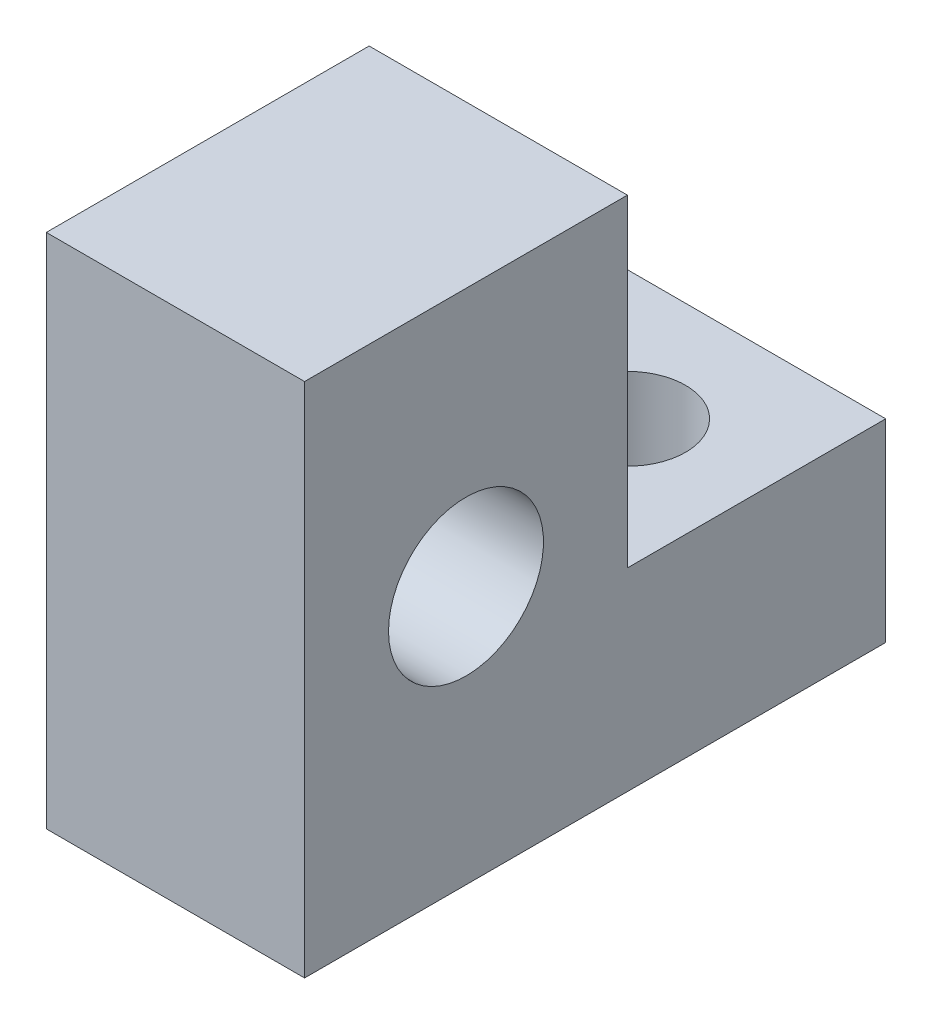
ISO-10303-21;
HEADER;
FILE_DESCRIPTION(('STEP AP214'),'2;1');
FILE_NAME('part.step','',(''),(''),'','','');
FILE_SCHEMA(('AUTOMOTIVE_DESIGN { 1 0 10303 214 1 1 1 1 }'));
ENDSEC;
DATA;
#1=APPLICATION_CONTEXT('core data for automotive mechanical design processes');
#2=APPLICATION_PROTOCOL_DEFINITION('international standard','automotive_design',2000,#1);
#3=PRODUCT_CONTEXT('',#1,'mechanical');
#4=PRODUCT('Part','Part','',(#3));
#5=PRODUCT_RELATED_PRODUCT_CATEGORY('part','',(#4));
#6=PRODUCT_DEFINITION_FORMATION('','',#4);
#7=PRODUCT_DEFINITION_CONTEXT('part definition',#1,'design');
#8=PRODUCT_DEFINITION('design','',#6,#7);
#9=PRODUCT_DEFINITION_SHAPE('','',#8);
#10=(LENGTH_UNIT() NAMED_UNIT(*) SI_UNIT(.MILLI.,.METRE.));
#11=(NAMED_UNIT(*) PLANE_ANGLE_UNIT() SI_UNIT($,.RADIAN.));
#12=(NAMED_UNIT(*) SI_UNIT($,.STERADIAN.) SOLID_ANGLE_UNIT());
#13=UNCERTAINTY_MEASURE_WITH_UNIT(LENGTH_MEASURE(1.E-05),#10,'distance_accuracy_value','');
#14=(GEOMETRIC_REPRESENTATION_CONTEXT(3) GLOBAL_UNCERTAINTY_ASSIGNED_CONTEXT((#13)) GLOBAL_UNIT_ASSIGNED_CONTEXT((#10,
#11,#12)) REPRESENTATION_CONTEXT('',''));
#15=CARTESIAN_POINT('',(0.,0.,0.));
#16=DIRECTION('',(0.,0.,1.));
#17=DIRECTION('',(1.,0.,0.));
#18=AXIS2_PLACEMENT_3D('',#15,#16,#17);
#19=CARTESIAN_POINT('',(-2.,4.,-2.49999999999997));
#20=DIRECTION('',(0.,0.,1.));
#21=DIRECTION('',(1.,0.,0.));
#22=AXIS2_PLACEMENT_3D('',#19,#20,#21);
#23=PLANE('',#22);
#24=DIRECTION('',(1.,0.,0.));
#25=VECTOR('',#24,1.);
#26=CARTESIAN_POINT('',(2.,-1.,-2.49999999999997));
#27=LINE('',#26,#25);
#28=CARTESIAN_POINT('',(-2.,-1.,-2.49999999999997));
#29=VERTEX_POINT('',#28);
#30=CARTESIAN_POINT('',(2.,-1.,-2.49999999999997));
#31=VERTEX_POINT('',#30);
#32=EDGE_CURVE('E59',#29,#31,#27,.T.);
#33=ORIENTED_EDGE('',*,*,#32,.F.);
#34=DIRECTION('',(0.,-1.,0.));
#35=VECTOR('',#34,1.);
#36=CARTESIAN_POINT('',(-2.,4.,-2.49999999999997));
#37=LINE('',#36,#35);
#38=CARTESIAN_POINT('',(-2.,4.,-2.49999999999997));
#39=VERTEX_POINT('',#38);
#40=EDGE_CURVE('E53',#39,#29,#37,.T.);
#41=ORIENTED_EDGE('',*,*,#40,.F.);
#42=DIRECTION('',(-1.,0.,0.));
#43=VECTOR('',#42,1.);
#44=CARTESIAN_POINT('',(-2.,4.,-2.49999999999997));
#45=LINE('',#44,#43);
#46=CARTESIAN_POINT('',(2.,4.,-2.49999999999997));
#47=VERTEX_POINT('',#46);
#48=EDGE_CURVE('E88',#47,#39,#45,.T.);
#49=ORIENTED_EDGE('',*,*,#48,.F.);
#50=DIRECTION('',(0.,-1.,0.));
#51=VECTOR('',#50,1.);
#52=CARTESIAN_POINT('',(2.,4.,-2.49999999999997));
#53=LINE('',#52,#51);
#54=EDGE_CURVE('E13',#47,#31,#53,.T.);
#55=ORIENTED_EDGE('',*,*,#54,.T.);
#56=EDGE_LOOP('',(#33,#41,#49,#55));
#57=FACE_BOUND('',#56,.T.);
#58=ADVANCED_FACE('F45',(#57),#23,.F.);
#59=CARTESIAN_POINT('',(2.,4.,2.50000000000003));
#60=DIRECTION('',(-1.,0.,0.));
#61=DIRECTION('',(0.,0.,1.));
#62=AXIS2_PLACEMENT_3D('',#59,#60,#61);
#63=PLANE('',#62);
#64=CARTESIAN_POINT('',(2.,0.,0.));
#65=DIRECTION('',(-1.,0.,0.));
#66=DIRECTION('',(0.,0.,1.));
#67=AXIS2_PLACEMENT_3D('',#64,#65,#66);
#68=CIRCLE('',#67,1.2);
#69=CARTESIAN_POINT('',(2.,0.,1.2));
#70=VERTEX_POINT('',#69);
#71=EDGE_CURVE('E192',#70,#70,#68,.T.);
#72=ORIENTED_EDGE('',*,*,#71,.T.);
#73=EDGE_LOOP('',(#72));
#74=FACE_BOUND('',#73,.T.);
#75=DIRECTION('',(0.,0.,-1.));
#76=VECTOR('',#75,1.);
#77=CARTESIAN_POINT('',(2.,-4.,2.50000000000003));
#78=LINE('',#77,#76);
#79=CARTESIAN_POINT('',(2.,-4.,2.50000000000003));
#80=VERTEX_POINT('',#79);
#81=CARTESIAN_POINT('',(2.,-4.,-6.49999999999997));
#82=VERTEX_POINT('',#81);
#83=EDGE_CURVE('E105',#80,#82,#78,.T.);
#84=ORIENTED_EDGE('',*,*,#83,.T.);
#85=DIRECTION('',(0.,-1.,0.));
#86=VECTOR('',#85,1.);
#87=CARTESIAN_POINT('',(2.,-4.,-6.49999999999997));
#88=LINE('',#87,#86);
#89=CARTESIAN_POINT('',(2.,-1.,-6.49999999999997));
#90=VERTEX_POINT('',#89);
#91=EDGE_CURVE('E109',#90,#82,#88,.T.);
#92=ORIENTED_EDGE('',*,*,#91,.F.);
#93=DIRECTION('',(0.,0.,1.));
#94=VECTOR('',#93,1.);
#95=CARTESIAN_POINT('',(2.,-1.,-6.49999999999997));
#96=LINE('',#95,#94);
#97=EDGE_CURVE('E134',#90,#31,#96,.T.);
#98=ORIENTED_EDGE('',*,*,#97,.T.);
#99=ORIENTED_EDGE('',*,*,#54,.F.);
#100=DIRECTION('',(0.,0.,-1.));
#101=VECTOR('',#100,1.);
#102=CARTESIAN_POINT('',(2.,4.,2.50000000000003));
#103=LINE('',#102,#101);
#104=CARTESIAN_POINT('',(2.,4.,2.50000000000003));
#105=VERTEX_POINT('',#104);
#106=EDGE_CURVE('E139',#105,#47,#103,.T.);
#107=ORIENTED_EDGE('',*,*,#106,.F.);
#108=DIRECTION('',(0.,-1.,0.));
#109=VECTOR('',#108,1.);
#110=CARTESIAN_POINT('',(2.,4.,2.50000000000003));
#111=LINE('',#110,#109);
#112=EDGE_CURVE('E111',#105,#80,#111,.T.);
#113=ORIENTED_EDGE('',*,*,#112,.T.);
#114=EDGE_LOOP('',(#84,#92,#98,#99,#107,#113));
#115=FACE_BOUND('',#114,.T.);
#116=ADVANCED_FACE('F47',(#74,#115),#63,.F.);
#117=CARTESIAN_POINT('',(-2.,4.,2.50000000000003));
#118=DIRECTION('',(1.,0.,0.));
#119=DIRECTION('',(0.,0.,-1.));
#120=AXIS2_PLACEMENT_3D('',#117,#118,#119);
#121=PLANE('',#120);
#122=CARTESIAN_POINT('',(-2.,0.,0.));
#123=DIRECTION('',(-1.,0.,0.));
#124=DIRECTION('',(0.,0.,1.));
#125=AXIS2_PLACEMENT_3D('',#122,#123,#124);
#126=CIRCLE('',#125,1.2);
#127=CARTESIAN_POINT('',(-2.,0.,1.2));
#128=VERTEX_POINT('',#127);
#129=EDGE_CURVE('E195',#128,#128,#126,.T.);
#130=ORIENTED_EDGE('',*,*,#129,.F.);
#131=EDGE_LOOP('',(#130));
#132=FACE_BOUND('',#131,.T.);
#133=DIRECTION('',(0.,0.,1.));
#134=VECTOR('',#133,1.);
#135=CARTESIAN_POINT('',(-2.,-4.,2.50000000000003));
#136=LINE('',#135,#134);
#137=CARTESIAN_POINT('',(-2.,-4.,-6.49999999999997));
#138=VERTEX_POINT('',#137);
#139=CARTESIAN_POINT('',(-2.,-4.,2.50000000000003));
#140=VERTEX_POINT('',#139);
#141=EDGE_CURVE('E113',#138,#140,#136,.T.);
#142=ORIENTED_EDGE('',*,*,#141,.T.);
#143=DIRECTION('',(0.,-1.,0.));
#144=VECTOR('',#143,1.);
#145=CARTESIAN_POINT('',(-2.,4.,2.50000000000003));
#146=LINE('',#145,#144);
#147=CARTESIAN_POINT('',(-2.,4.,2.50000000000003));
#148=VERTEX_POINT('',#147);
#149=EDGE_CURVE('E148',#148,#140,#146,.T.);
#150=ORIENTED_EDGE('',*,*,#149,.F.);
#151=DIRECTION('',(0.,0.,1.));
#152=VECTOR('',#151,1.);
#153=CARTESIAN_POINT('',(-2.,4.,2.50000000000003));
#154=LINE('',#153,#152);
#155=EDGE_CURVE('E142',#39,#148,#154,.T.);
#156=ORIENTED_EDGE('',*,*,#155,.F.);
#157=ORIENTED_EDGE('',*,*,#40,.T.);
#158=DIRECTION('',(0.,0.,1.));
#159=VECTOR('',#158,1.);
#160=CARTESIAN_POINT('',(-2.,-1.,-6.49999999999997));
#161=LINE('',#160,#159);
#162=CARTESIAN_POINT('',(-2.,-1.,-6.49999999999997));
#163=VERTEX_POINT('',#162);
#164=EDGE_CURVE('E114',#163,#29,#161,.T.);
#165=ORIENTED_EDGE('',*,*,#164,.F.);
#166=DIRECTION('',(0.,1.,0.));
#167=VECTOR('',#166,1.);
#168=CARTESIAN_POINT('',(-2.,-4.,-6.49999999999997));
#169=LINE('',#168,#167);
#170=EDGE_CURVE('E121',#138,#163,#169,.T.);
#171=ORIENTED_EDGE('',*,*,#170,.F.);
#172=EDGE_LOOP('',(#142,#150,#156,#157,#165,#171));
#173=FACE_BOUND('',#172,.T.);
#174=ADVANCED_FACE('F152',(#132,#173),#121,.F.);
#175=CARTESIAN_POINT('',(-2.,4.,2.50000000000003));
#176=DIRECTION('',(0.,0.,-1.));
#177=DIRECTION('',(-1.,0.,0.));
#178=AXIS2_PLACEMENT_3D('',#175,#176,#177);
#179=PLANE('',#178);
#180=DIRECTION('',(1.,0.,0.));
#181=VECTOR('',#180,1.);
#182=CARTESIAN_POINT('',(-2.,-4.,2.50000000000003));
#183=LINE('',#182,#181);
#184=EDGE_CURVE('E83',#140,#80,#183,.T.);
#185=ORIENTED_EDGE('',*,*,#184,.T.);
#186=ORIENTED_EDGE('',*,*,#112,.F.);
#187=DIRECTION('',(1.,0.,0.));
#188=VECTOR('',#187,1.);
#189=CARTESIAN_POINT('',(-2.,4.,2.50000000000003));
#190=LINE('',#189,#188);
#191=EDGE_CURVE('E68',#148,#105,#190,.T.);
#192=ORIENTED_EDGE('',*,*,#191,.F.);
#193=ORIENTED_EDGE('',*,*,#149,.T.);
#194=EDGE_LOOP('',(#185,#186,#192,#193));
#195=FACE_BOUND('',#194,.T.);
#196=ADVANCED_FACE('F165',(#195),#179,.F.);
#197=CARTESIAN_POINT('',(0.,4.,0.));
#198=DIRECTION('',(0.,-1.,0.));
#199=DIRECTION('',(0.,0.,-1.));
#200=AXIS2_PLACEMENT_3D('',#197,#198,#199);
#201=PLANE('',#200);
#202=ORIENTED_EDGE('',*,*,#106,.T.);
#203=ORIENTED_EDGE('',*,*,#48,.T.);
#204=ORIENTED_EDGE('',*,*,#155,.T.);
#205=ORIENTED_EDGE('',*,*,#191,.T.);
#206=EDGE_LOOP('',(#202,#203,#204,#205));
#207=FACE_BOUND('',#206,.T.);
#208=ADVANCED_FACE('F169',(#207),#201,.F.);
#209=CARTESIAN_POINT('',(0.,-4.,0.));
#210=DIRECTION('',(0.,-1.,0.));
#211=DIRECTION('',(0.,0.,-1.));
#212=AXIS2_PLACEMENT_3D('',#209,#210,#211);
#213=PLANE('',#212);
#214=CARTESIAN_POINT('',(0.,-4.,-4.49999999999997));
#215=DIRECTION('',(0.,-1.,0.));
#216=DIRECTION('',(0.,0.,-1.));
#217=AXIS2_PLACEMENT_3D('',#214,#215,#216);
#218=CIRCLE('',#217,0.899999999999988);
#219=CARTESIAN_POINT('',(0.,-4.,-5.39999999999996));
#220=VERTEX_POINT('',#219);
#221=EDGE_CURVE('E128',#220,#220,#218,.T.);
#222=ORIENTED_EDGE('',*,*,#221,.F.);
#223=EDGE_LOOP('',(#222));
#224=FACE_BOUND('',#223,.T.);
#225=ORIENTED_EDGE('',*,*,#83,.F.);
#226=ORIENTED_EDGE('',*,*,#184,.F.);
#227=ORIENTED_EDGE('',*,*,#141,.F.);
#228=DIRECTION('',(-1.,0.,0.));
#229=VECTOR('',#228,1.);
#230=CARTESIAN_POINT('',(2.,-4.,-6.49999999999997));
#231=LINE('',#230,#229);
#232=EDGE_CURVE('E117',#82,#138,#231,.T.);
#233=ORIENTED_EDGE('',*,*,#232,.F.);
#234=EDGE_LOOP('',(#225,#226,#227,#233));
#235=FACE_BOUND('',#234,.T.);
#236=ADVANCED_FACE('F118',(#224,#235),#213,.T.);
#237=CARTESIAN_POINT('',(2.,-1.,-6.49999999999997));
#238=DIRECTION('',(0.,-1.,0.));
#239=DIRECTION('',(0.,0.,-1.));
#240=AXIS2_PLACEMENT_3D('',#237,#238,#239);
#241=PLANE('',#240);
#242=CARTESIAN_POINT('',(0.,-0.999999999999999,-4.49999999999997));
#243=DIRECTION('',(0.,1.,0.));
#244=DIRECTION('',(0.,0.,1.));
#245=AXIS2_PLACEMENT_3D('',#242,#243,#244);
#246=CIRCLE('',#245,0.899999999999989);
#247=CARTESIAN_POINT('',(0.,-0.999999999999999,-3.59999999999998));
#248=VERTEX_POINT('',#247);
#249=EDGE_CURVE('E197',#248,#248,#246,.T.);
#250=ORIENTED_EDGE('',*,*,#249,.F.);
#251=EDGE_LOOP('',(#250));
#252=FACE_BOUND('',#251,.T.);
#253=ORIENTED_EDGE('',*,*,#32,.T.);
#254=ORIENTED_EDGE('',*,*,#97,.F.);
#255=DIRECTION('',(1.,0.,0.));
#256=VECTOR('',#255,1.);
#257=CARTESIAN_POINT('',(2.,-1.,-6.49999999999997));
#258=LINE('',#257,#256);
#259=EDGE_CURVE('E125',#163,#90,#258,.T.);
#260=ORIENTED_EDGE('',*,*,#259,.F.);
#261=ORIENTED_EDGE('',*,*,#164,.T.);
#262=EDGE_LOOP('',(#253,#254,#260,#261));
#263=FACE_BOUND('',#262,.T.);
#264=ADVANCED_FACE('F155',(#252,#263),#241,.F.);
#265=CARTESIAN_POINT('',(0.,0.,-6.49999999999997));
#266=DIRECTION('',(0.,0.,1.));
#267=DIRECTION('',(1.,0.,0.));
#268=AXIS2_PLACEMENT_3D('',#265,#266,#267);
#269=PLANE('',#268);
#270=ORIENTED_EDGE('',*,*,#91,.T.);
#271=ORIENTED_EDGE('',*,*,#232,.T.);
#272=ORIENTED_EDGE('',*,*,#170,.T.);
#273=ORIENTED_EDGE('',*,*,#259,.T.);
#274=EDGE_LOOP('',(#270,#271,#272,#273));
#275=FACE_BOUND('',#274,.T.);
#276=ADVANCED_FACE('F123',(#275),#269,.F.);
#277=CARTESIAN_POINT('',(0.,-1.,-4.49999999999997));
#278=DIRECTION('',(0.,1.,0.));
#279=DIRECTION('',(0.,0.,1.));
#280=AXIS2_PLACEMENT_3D('',#277,#278,#279);
#281=CYLINDRICAL_SURFACE('',#280,0.899999999999988);
#282=ORIENTED_EDGE('',*,*,#221,.T.);
#283=EDGE_LOOP('',(#282));
#284=FACE_BOUND('',#283,.T.);
#285=ORIENTED_EDGE('',*,*,#249,.T.);
#286=EDGE_LOOP('',(#285));
#287=FACE_BOUND('',#286,.T.);
#288=ADVANCED_FACE('F180',(#284,#287),#281,.F.);
#289=CARTESIAN_POINT('',(-2.,0.,0.));
#290=DIRECTION('',(-1.,0.,0.));
#291=DIRECTION('',(0.,0.,1.));
#292=AXIS2_PLACEMENT_3D('',#289,#290,#291);
#293=CYLINDRICAL_SURFACE('',#292,1.2);
#294=ORIENTED_EDGE('',*,*,#71,.F.);
#295=EDGE_LOOP('',(#294));
#296=FACE_BOUND('',#295,.T.);
#297=ORIENTED_EDGE('',*,*,#129,.T.);
#298=EDGE_LOOP('',(#297));
#299=FACE_BOUND('',#298,.T.);
#300=ADVANCED_FACE('F183',(#296,#299),#293,.F.);
#301=CLOSED_SHELL('',(#58,#116,#174,#196,#208,#236,#264,#276,#288,#300));
#302=MANIFOLD_SOLID_BREP('B2',#301);
#303=ADVANCED_BREP_SHAPE_REPRESENTATION('',(#18,#302),#14);
#304=SHAPE_DEFINITION_REPRESENTATION(#9,#303);
ENDSEC;
END-ISO-10303-21;
